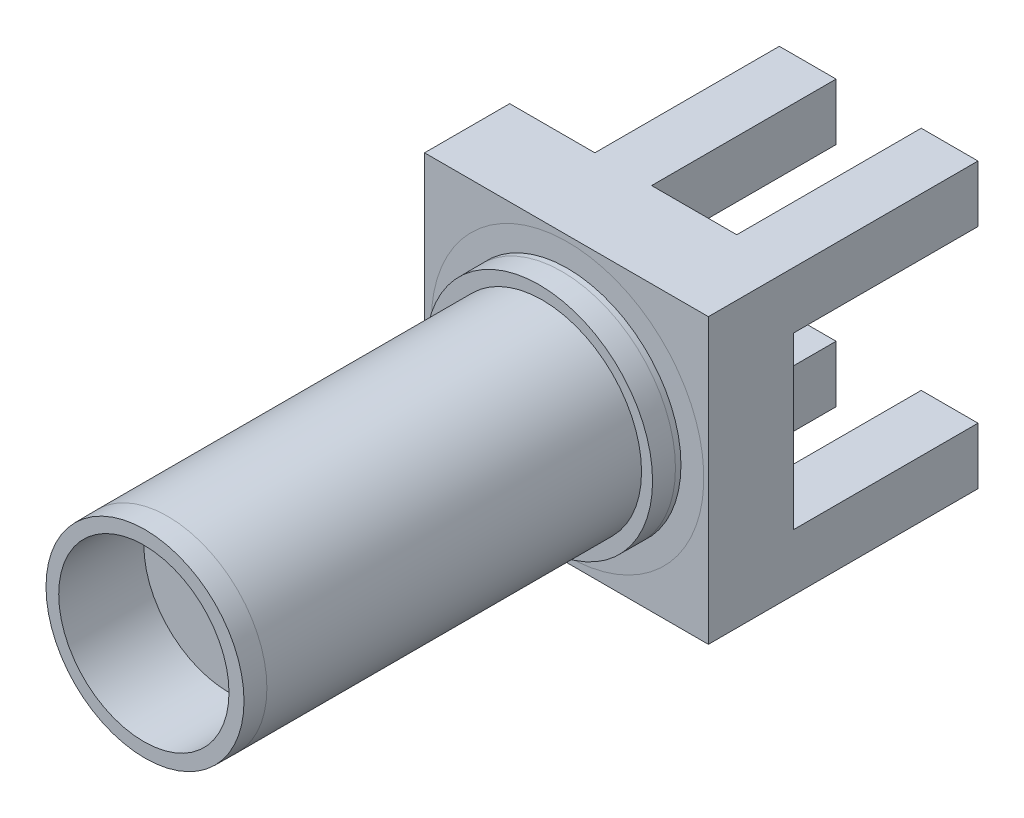
ISO-10303-21;
HEADER;
FILE_DESCRIPTION(('STEP AP214'),'2;1');
FILE_NAME('part.step','',(''),(''),'','','');
FILE_SCHEMA(('AUTOMOTIVE_DESIGN { 1 0 10303 214 1 1 1 1 }'));
ENDSEC;
DATA;
#1=APPLICATION_CONTEXT('core data for automotive mechanical design processes');
#2=APPLICATION_PROTOCOL_DEFINITION('international standard','automotive_design',2000,#1);
#3=PRODUCT_CONTEXT('',#1,'mechanical');
#4=PRODUCT('Part','Part','',(#3));
#5=PRODUCT_RELATED_PRODUCT_CATEGORY('part','',(#4));
#6=PRODUCT_DEFINITION_FORMATION('','',#4);
#7=PRODUCT_DEFINITION_CONTEXT('part definition',#1,'design');
#8=PRODUCT_DEFINITION('design','',#6,#7);
#9=PRODUCT_DEFINITION_SHAPE('','',#8);
#10=(LENGTH_UNIT() NAMED_UNIT(*) SI_UNIT(.MILLI.,.METRE.));
#11=(NAMED_UNIT(*) PLANE_ANGLE_UNIT() SI_UNIT($,.RADIAN.));
#12=(NAMED_UNIT(*) SI_UNIT($,.STERADIAN.) SOLID_ANGLE_UNIT());
#13=UNCERTAINTY_MEASURE_WITH_UNIT(LENGTH_MEASURE(1.E-05),#10,'distance_accuracy_value','');
#14=(GEOMETRIC_REPRESENTATION_CONTEXT(3) GLOBAL_UNCERTAINTY_ASSIGNED_CONTEXT((#13)) GLOBAL_UNIT_ASSIGNED_CONTEXT((#10,
#11,#12)) REPRESENTATION_CONTEXT('',''));
#15=CARTESIAN_POINT('',(0.,0.,0.));
#16=DIRECTION('',(0.,0.,1.));
#17=DIRECTION('',(1.,0.,0.));
#18=AXIS2_PLACEMENT_3D('',#15,#16,#17);
#19=CARTESIAN_POINT('',(-6.14624505928853,5.,-6.5));
#20=DIRECTION('',(0.,0.,1.));
#21=DIRECTION('',(1.,0.,0.));
#22=AXIS2_PLACEMENT_3D('',#19,#20,#21);
#23=CYLINDRICAL_SURFACE('',#22,1.);
#24=CARTESIAN_POINT('',(-6.14624505928853,5.,-6.3));
#25=DIRECTION('',(0.,0.,-1.));
#26=DIRECTION('',(-1.,0.,0.));
#27=AXIS2_PLACEMENT_3D('',#24,#25,#26);
#28=CIRCLE('',#27,1.);
#29=CARTESIAN_POINT('',(-5.14624505928853,5.,-6.3));
#30=VERTEX_POINT('',#29);
#31=EDGE_CURVE('E11',#30,#30,#28,.F.);
#32=CARTESIAN_POINT('',(-6.14624505928853,5.,0.));
#33=DIRECTION('',(0.,0.,-1.));
#34=DIRECTION('',(-1.,0.,0.));
#35=AXIS2_PLACEMENT_3D('',#32,#33,#34);
#36=CIRCLE('',#35,1.);
#37=CARTESIAN_POINT('',(-5.14624505928853,5.,0.));
#38=VERTEX_POINT('',#37);
#39=EDGE_CURVE('E62',#38,#38,#36,.T.);
#40=CARTESIAN_POINT('',(-5.14624505928853,5.,-6.3));
#41=CARTESIAN_POINT('',(-5.14624505928853,5.,-6.234375));
#42=CARTESIAN_POINT('',(-5.14624505928853,5.,-6.16875));
#43=CARTESIAN_POINT('',(-5.14624505928853,5.,-6.0375));
#44=CARTESIAN_POINT('',(-5.14624505928853,5.,-5.971875));
#45=CARTESIAN_POINT('',(-5.14624505928853,5.,-5.840625));
#46=CARTESIAN_POINT('',(-5.14624505928853,5.,-5.775));
#47=CARTESIAN_POINT('',(-5.14624505928853,5.,-5.64375));
#48=CARTESIAN_POINT('',(-5.14624505928853,5.,-5.578125));
#49=CARTESIAN_POINT('',(-5.14624505928853,5.,-5.446875));
#50=CARTESIAN_POINT('',(-5.14624505928853,5.,-5.38125));
#51=CARTESIAN_POINT('',(-5.14624505928853,5.,-5.25));
#52=CARTESIAN_POINT('',(-5.14624505928853,5.,-5.184375));
#53=CARTESIAN_POINT('',(-5.14624505928853,5.,-5.053125));
#54=CARTESIAN_POINT('',(-5.14624505928853,5.,-4.9875));
#55=CARTESIAN_POINT('',(-5.14624505928853,5.,-4.85625));
#56=CARTESIAN_POINT('',(-5.14624505928853,5.,-4.790625));
#57=CARTESIAN_POINT('',(-5.14624505928853,5.,-4.659375));
#58=CARTESIAN_POINT('',(-5.14624505928853,5.,-4.59375));
#59=CARTESIAN_POINT('',(-5.14624505928853,5.,-4.4625));
#60=CARTESIAN_POINT('',(-5.14624505928853,5.,-4.396875));
#61=CARTESIAN_POINT('',(-5.14624505928853,5.,-4.265625));
#62=CARTESIAN_POINT('',(-5.14624505928853,5.,-4.2));
#63=CARTESIAN_POINT('',(-5.14624505928853,5.,-4.06875));
#64=CARTESIAN_POINT('',(-5.14624505928853,5.,-4.003125));
#65=CARTESIAN_POINT('',(-5.14624505928853,5.,-3.871875));
#66=CARTESIAN_POINT('',(-5.14624505928853,5.,-3.80625));
#67=CARTESIAN_POINT('',(-5.14624505928853,5.,-3.675));
#68=CARTESIAN_POINT('',(-5.14624505928853,5.,-3.609375));
#69=CARTESIAN_POINT('',(-5.14624505928853,5.,-3.478125));
#70=CARTESIAN_POINT('',(-5.14624505928853,5.,-3.4125));
#71=CARTESIAN_POINT('',(-5.14624505928853,5.,-3.28125));
#72=CARTESIAN_POINT('',(-5.14624505928853,5.,-3.215625));
#73=CARTESIAN_POINT('',(-5.14624505928853,5.,-3.084375));
#74=CARTESIAN_POINT('',(-5.14624505928853,5.,-3.01875));
#75=CARTESIAN_POINT('',(-5.14624505928853,5.,-2.8875));
#76=CARTESIAN_POINT('',(-5.14624505928853,5.,-2.821875));
#77=CARTESIAN_POINT('',(-5.14624505928853,5.,-2.690625));
#78=CARTESIAN_POINT('',(-5.14624505928853,5.,-2.625));
#79=CARTESIAN_POINT('',(-5.14624505928853,5.,-2.49375));
#80=CARTESIAN_POINT('',(-5.14624505928853,5.,-2.428125));
#81=CARTESIAN_POINT('',(-5.14624505928853,5.,-2.296875));
#82=CARTESIAN_POINT('',(-5.14624505928853,5.,-2.23125));
#83=CARTESIAN_POINT('',(-5.14624505928853,5.,-2.1));
#84=CARTESIAN_POINT('',(-5.14624505928853,5.,-2.034375));
#85=CARTESIAN_POINT('',(-5.14624505928853,5.,-1.903125));
#86=CARTESIAN_POINT('',(-5.14624505928853,5.,-1.8375));
#87=CARTESIAN_POINT('',(-5.14624505928853,5.,-1.70625));
#88=CARTESIAN_POINT('',(-5.14624505928853,5.,-1.640625));
#89=CARTESIAN_POINT('',(-5.14624505928853,5.,-1.509375));
#90=CARTESIAN_POINT('',(-5.14624505928853,5.,-1.44375));
#91=CARTESIAN_POINT('',(-5.14624505928853,5.,-1.3125));
#92=CARTESIAN_POINT('',(-5.14624505928853,5.,-1.246875));
#93=CARTESIAN_POINT('',(-5.14624505928853,5.,-1.115625));
#94=CARTESIAN_POINT('',(-5.14624505928853,5.,-1.05));
#95=CARTESIAN_POINT('',(-5.14624505928853,5.,-0.918750000000001));
#96=CARTESIAN_POINT('',(-5.14624505928853,5.,-0.853125));
#97=CARTESIAN_POINT('',(-5.14624505928853,5.,-0.721875));
#98=CARTESIAN_POINT('',(-5.14624505928853,5.,-0.65625));
#99=CARTESIAN_POINT('',(-5.14624505928853,5.,-0.525));
#100=CARTESIAN_POINT('',(-5.14624505928853,5.,-0.459375));
#101=CARTESIAN_POINT('',(-5.14624505928853,5.,-0.328125));
#102=CARTESIAN_POINT('',(-5.14624505928853,5.,-0.2625));
#103=CARTESIAN_POINT('',(-5.14624505928853,5.,-0.13125));
#104=CARTESIAN_POINT('',(-5.14624505928853,5.,-0.065625));
#105=CARTESIAN_POINT('',(-5.14624505928853,5.,0.));
#106=B_SPLINE_CURVE_WITH_KNOTS('',3,(#40,#41,#42,#43,#44,#45,#46,#47,#48,#49,#50,#51,#52,#53,
#54,#55,#56,#57,#58,#59,#60,#61,#62,#63,#64,#65,#66,#67,#68,#69,#70,#71,#72,#73,#74,#75,#76,#77,
#78,#79,#80,#81,#82,#83,#84,#85,#86,#87,#88,#89,#90,#91,#92,#93,#94,#95,#96,#97,#98,#99,#100,
#101,#102,#103,#104,#105),.UNSPECIFIED.,.F.,.F.,(4,2,2,2,2,2,2,2,2,2,2,2,2,2,2,2,2,2,2,2,2,2,2,
2,2,2,2,2,2,2,2,2,4),(0.,0.196875,0.39375,0.590625,0.7875,0.984375,1.18125,1.378125,1.575,
1.771875,1.96875,2.165625,2.3625,2.559375,2.75625,2.953125,3.15,3.346875,3.54375,3.740625,
3.9375,4.134375,4.33125,4.528125,4.725,4.921875,5.11875,5.315625,5.5125,5.709375,5.90625,
6.103125,6.3),.UNSPECIFIED.);
#107=EDGE_CURVE('BSEAM50',#30,#38,#106,.T.);
#108=ORIENTED_EDGE('',*,*,#31,.T.);
#109=ORIENTED_EDGE('',*,*,#39,.T.);
#110=ORIENTED_EDGE('',*,*,#107,.T.);
#111=ORIENTED_EDGE('',*,*,#107,.F.);
#112=EDGE_LOOP('',(#108,#110,#109,#111));
#113=FACE_BOUND('',#112,.T.);
#114=ADVANCED_FACE('F50',(#113),#23,.T.);
#115=CARTESIAN_POINT('',(-6.14624505928853,5.,-6.5));
#116=DIRECTION('',(0.,0.,-1.));
#117=DIRECTION('',(-1.,0.,0.));
#118=AXIS2_PLACEMENT_3D('',#115,#116,#117);
#119=PLANE('',#118);
#120=CARTESIAN_POINT('',(-6.14624505928853,5.,-6.5));
#121=DIRECTION('',(0.,0.,-1.));
#122=DIRECTION('',(-1.,0.,0.));
#123=AXIS2_PLACEMENT_3D('',#120,#121,#122);
#124=CIRCLE('',#123,0.800000000000005);
#125=CARTESIAN_POINT('',(-6.94624505928853,5.,-6.5));
#126=VERTEX_POINT('',#125);
#127=EDGE_CURVE('E58',#126,#126,#124,.T.);
#128=ORIENTED_EDGE('',*,*,#127,.T.);
#129=EDGE_LOOP('',(#128));
#130=FACE_BOUND('',#129,.T.);
#131=ADVANCED_FACE('F72',(#130),#119,.T.);
#132=CARTESIAN_POINT('',(-6.14624505928853,5.,0.));
#133=DIRECTION('',(0.,0.,-1.));
#134=DIRECTION('',(-1.,0.,0.));
#135=AXIS2_PLACEMENT_3D('',#132,#133,#134);
#136=PLANE('',#135);
#137=ORIENTED_EDGE('',*,*,#39,.F.);
#138=EDGE_LOOP('',(#137));
#139=FACE_BOUND('',#138,.T.);
#140=ADVANCED_FACE('F70',(#139),#136,.F.);
#141=CARTESIAN_POINT('',(-6.14624505928853,5.,-6.5));
#142=DIRECTION('',(0.,0.,1.));
#143=DIRECTION('',(1.,0.,0.));
#144=AXIS2_PLACEMENT_3D('',#141,#142,#143);
#145=CONICAL_SURFACE('',#144,0.800000000000005,0.785398163397446);
#146=ORIENTED_EDGE('',*,*,#31,.F.);
#147=EDGE_LOOP('',(#146));
#148=FACE_BOUND('',#147,.T.);
#149=ORIENTED_EDGE('',*,*,#127,.F.);
#150=EDGE_LOOP('',(#149));
#151=FACE_BOUND('',#150,.T.);
#152=ADVANCED_FACE('F53',(#148,#151),#145,.T.);
#153=CLOSED_SHELL('',(#114,#131,#140,#152));
#154=MANIFOLD_SOLID_BREP('B2',#153);
#155=CARTESIAN_POINT('',(0.,0.,0.));
#156=DIRECTION('',(0.,0.,-1.));
#157=DIRECTION('',(-1.,0.,0.));
#158=AXIS2_PLACEMENT_3D('',#155,#156,#157);
#159=PLANE('',#158);
#160=CARTESIAN_POINT('',(-6.14624505928853,5.,0.));
#161=DIRECTION('',(0.,0.,1.));
#162=DIRECTION('',(1.,0.,0.));
#163=AXIS2_PLACEMENT_3D('',#160,#161,#162);
#164=CIRCLE('',#163,2.5);
#165=CARTESIAN_POINT('',(-8.64624505928853,5.,0.));
#166=VERTEX_POINT('',#165);
#167=EDGE_CURVE('E341',#166,#166,#164,.T.);
#168=ORIENTED_EDGE('',*,*,#167,.T.);
#169=EDGE_LOOP('',(#168));
#170=FACE_BOUND('',#169,.T.);
#171=DIRECTION('',(0.,1.,0.));
#172=VECTOR('',#171,1.);
#173=CARTESIAN_POINT('',(-3.14624505928853,10.,0.));
#174=LINE('',#173,#172);
#175=CARTESIAN_POINT('',(-3.14624505928853,8.,0.));
#176=VERTEX_POINT('',#175);
#177=CARTESIAN_POINT('',(-3.14624505928853,10.,0.));
#178=VERTEX_POINT('',#177);
#179=EDGE_CURVE('E261',#176,#178,#174,.T.);
#180=ORIENTED_EDGE('',*,*,#179,.F.);
#181=DIRECTION('',(-1.,0.,0.));
#182=VECTOR('',#181,1.);
#183=CARTESIAN_POINT('',(-1.14624505928853,8.,0.));
#184=LINE('',#183,#182);
#185=CARTESIAN_POINT('',(-1.14624505928853,8.,0.));
#186=VERTEX_POINT('',#185);
#187=EDGE_CURVE('E407',#186,#176,#184,.T.);
#188=ORIENTED_EDGE('',*,*,#187,.F.);
#189=DIRECTION('',(0.,1.,0.));
#190=VECTOR('',#189,1.);
#191=CARTESIAN_POINT('',(-1.14624505928853,0.,0.));
#192=LINE('',#191,#190);
#193=CARTESIAN_POINT('',(-1.14624505928853,2.,0.));
#194=VERTEX_POINT('',#193);
#195=EDGE_CURVE('E266',#194,#186,#192,.T.);
#196=ORIENTED_EDGE('',*,*,#195,.F.);
#197=DIRECTION('',(-1.,0.,0.));
#198=VECTOR('',#197,1.);
#199=CARTESIAN_POINT('',(-1.14624505928853,2.,0.));
#200=LINE('',#199,#198);
#201=CARTESIAN_POINT('',(-3.14624505928853,2.,0.));
#202=VERTEX_POINT('',#201);
#203=EDGE_CURVE('E315',#194,#202,#200,.T.);
#204=ORIENTED_EDGE('',*,*,#203,.T.);
#205=DIRECTION('',(0.,1.,0.));
#206=VECTOR('',#205,1.);
#207=CARTESIAN_POINT('',(-3.14624505928853,0.,0.));
#208=LINE('',#207,#206);
#209=CARTESIAN_POINT('',(-3.14624505928853,0.,0.));
#210=VERTEX_POINT('',#209);
#211=EDGE_CURVE('E328',#210,#202,#208,.T.);
#212=ORIENTED_EDGE('',*,*,#211,.F.);
#213=DIRECTION('',(-1.,0.,0.));
#214=VECTOR('',#213,1.);
#215=CARTESIAN_POINT('',(-1.14624505928853,0.,0.));
#216=LINE('',#215,#214);
#217=CARTESIAN_POINT('',(-6.14624505928853,0.,0.));
#218=VERTEX_POINT('',#217);
#219=EDGE_CURVE('E370',#210,#218,#216,.T.);
#220=ORIENTED_EDGE('',*,*,#219,.T.);
#221=DIRECTION('',(0.,1.,0.));
#222=VECTOR('',#221,1.);
#223=CARTESIAN_POINT('',(-6.14624505928853,0.,0.));
#224=LINE('',#223,#222);
#225=CARTESIAN_POINT('',(-6.14624505928853,2.,0.));
#226=VERTEX_POINT('',#225);
#227=EDGE_CURVE('E138',#218,#226,#224,.T.);
#228=ORIENTED_EDGE('',*,*,#227,.T.);
#229=DIRECTION('',(-1.,0.,0.));
#230=VECTOR('',#229,1.);
#231=CARTESIAN_POINT('',(-6.14624505928853,2.,0.));
#232=LINE('',#231,#230);
#233=CARTESIAN_POINT('',(-8.14624505928853,2.,0.));
#234=VERTEX_POINT('',#233);
#235=EDGE_CURVE('E296',#226,#234,#232,.T.);
#236=ORIENTED_EDGE('',*,*,#235,.T.);
#237=DIRECTION('',(0.,1.,0.));
#238=VECTOR('',#237,1.);
#239=CARTESIAN_POINT('',(-8.14624505928853,0.,0.));
#240=LINE('',#239,#238);
#241=CARTESIAN_POINT('',(-8.14624505928853,0.,0.));
#242=VERTEX_POINT('',#241);
#243=EDGE_CURVE('E309',#242,#234,#240,.T.);
#244=ORIENTED_EDGE('',*,*,#243,.F.);
#245=CARTESIAN_POINT('',(-11.1462450592885,0.,0.));
#246=VERTEX_POINT('',#245);
#247=EDGE_CURVE('E369',#242,#246,#216,.T.);
#248=ORIENTED_EDGE('',*,*,#247,.T.);
#249=DIRECTION('',(0.,1.,0.));
#250=VECTOR('',#249,1.);
#251=CARTESIAN_POINT('',(-11.1462450592885,0.,0.));
#252=LINE('',#251,#250);
#253=CARTESIAN_POINT('',(-11.1462450592885,10.,0.));
#254=VERTEX_POINT('',#253);
#255=EDGE_CURVE('E366',#246,#254,#252,.T.);
#256=ORIENTED_EDGE('',*,*,#255,.T.);
#257=DIRECTION('',(-1.,0.,0.));
#258=VECTOR('',#257,1.);
#259=CARTESIAN_POINT('',(-1.14624505928853,10.,0.));
#260=LINE('',#259,#258);
#261=CARTESIAN_POINT('',(-8.14624505928853,10.,0.));
#262=VERTEX_POINT('',#261);
#263=EDGE_CURVE('E352',#262,#254,#260,.T.);
#264=ORIENTED_EDGE('',*,*,#263,.F.);
#265=DIRECTION('',(0.,1.,0.));
#266=VECTOR('',#265,1.);
#267=CARTESIAN_POINT('',(-8.14624505928853,10.,0.));
#268=LINE('',#267,#266);
#269=CARTESIAN_POINT('',(-8.14624505928853,8.,0.));
#270=VERTEX_POINT('',#269);
#271=EDGE_CURVE('E130',#270,#262,#268,.T.);
#272=ORIENTED_EDGE('',*,*,#271,.F.);
#273=DIRECTION('',(-1.,0.,0.));
#274=VECTOR('',#273,1.);
#275=CARTESIAN_POINT('',(-6.14624505928853,8.,0.));
#276=LINE('',#275,#274);
#277=CARTESIAN_POINT('',(-6.14624505928853,8.,0.));
#278=VERTEX_POINT('',#277);
#279=EDGE_CURVE('E278',#278,#270,#276,.T.);
#280=ORIENTED_EDGE('',*,*,#279,.F.);
#281=DIRECTION('',(0.,-1.,0.));
#282=VECTOR('',#281,1.);
#283=CARTESIAN_POINT('',(-6.14624505928853,10.,0.));
#284=LINE('',#283,#282);
#285=CARTESIAN_POINT('',(-6.14624505928853,10.,0.));
#286=VERTEX_POINT('',#285);
#287=EDGE_CURVE('E268',#286,#278,#284,.T.);
#288=ORIENTED_EDGE('',*,*,#287,.F.);
#289=EDGE_CURVE('E364',#178,#286,#260,.T.);
#290=ORIENTED_EDGE('',*,*,#289,.F.);
#291=EDGE_LOOP('',(#180,#188,#196,#204,#212,#220,#228,#236,#244,#248,#256,#264,#272,#280,#288,#290));
#292=FACE_BOUND('',#291,.T.);
#293=ADVANCED_FACE('F114',(#170,#292),#159,.T.);
#294=CARTESIAN_POINT('',(-1.14624505928853,10.,3.));
#295=DIRECTION('',(0.,-1.,0.));
#296=DIRECTION('',(0.,0.,-1.));
#297=AXIS2_PLACEMENT_3D('',#294,#295,#296);
#298=PLANE('',#297);
#299=DIRECTION('',(0.,0.,-1.));
#300=VECTOR('',#299,1.);
#301=CARTESIAN_POINT('',(-1.14624505928853,10.,3.));
#302=LINE('',#301,#300);
#303=CARTESIAN_POINT('',(-1.14624505928853,10.,3.));
#304=VERTEX_POINT('',#303);
#305=CARTESIAN_POINT('',(-1.14624505928853,10.,-6.5));
#306=VERTEX_POINT('',#305);
#307=EDGE_CURVE('E363',#304,#306,#302,.T.);
#308=ORIENTED_EDGE('',*,*,#307,.T.);
#309=DIRECTION('',(1.,0.,0.));
#310=VECTOR('',#309,1.);
#311=CARTESIAN_POINT('',(-1.14624505928853,10.,-6.5));
#312=LINE('',#311,#310);
#313=CARTESIAN_POINT('',(-3.14624505928853,10.,-6.5));
#314=VERTEX_POINT('',#313);
#315=EDGE_CURVE('E258',#314,#306,#312,.T.);
#316=ORIENTED_EDGE('',*,*,#315,.F.);
#317=DIRECTION('',(0.,0.,1.));
#318=VECTOR('',#317,1.);
#319=CARTESIAN_POINT('',(-3.14624505928853,10.,-6.5));
#320=LINE('',#319,#318);
#321=EDGE_CURVE('E270',#314,#178,#320,.T.);
#322=ORIENTED_EDGE('',*,*,#321,.T.);
#323=ORIENTED_EDGE('',*,*,#289,.T.);
#324=DIRECTION('',(0.,0.,1.));
#325=VECTOR('',#324,1.);
#326=CARTESIAN_POINT('',(-6.14624505928853,10.,-6.5));
#327=LINE('',#326,#325);
#328=CARTESIAN_POINT('',(-6.14624505928853,10.,-6.5));
#329=VERTEX_POINT('',#328);
#330=EDGE_CURVE('E291',#329,#286,#327,.T.);
#331=ORIENTED_EDGE('',*,*,#330,.F.);
#332=DIRECTION('',(1.,0.,0.));
#333=VECTOR('',#332,1.);
#334=CARTESIAN_POINT('',(-6.14624505928853,10.,-6.5));
#335=LINE('',#334,#333);
#336=CARTESIAN_POINT('',(-8.14624505928853,10.,-6.5));
#337=VERTEX_POINT('',#336);
#338=EDGE_CURVE('E277',#337,#329,#335,.T.);
#339=ORIENTED_EDGE('',*,*,#338,.F.);
#340=DIRECTION('',(0.,0.,1.));
#341=VECTOR('',#340,1.);
#342=CARTESIAN_POINT('',(-8.14624505928853,10.,-6.5));
#343=LINE('',#342,#341);
#344=EDGE_CURVE('E294',#337,#262,#343,.T.);
#345=ORIENTED_EDGE('',*,*,#344,.T.);
#346=ORIENTED_EDGE('',*,*,#263,.T.);
#347=DIRECTION('',(0.,0.,-1.));
#348=VECTOR('',#347,1.);
#349=CARTESIAN_POINT('',(-11.1462450592885,10.,3.));
#350=LINE('',#349,#348);
#351=CARTESIAN_POINT('',(-11.1462450592885,10.,3.));
#352=VERTEX_POINT('',#351);
#353=EDGE_CURVE('E379',#352,#254,#350,.T.);
#354=ORIENTED_EDGE('',*,*,#353,.F.);
#355=DIRECTION('',(-1.,0.,0.));
#356=VECTOR('',#355,1.);
#357=CARTESIAN_POINT('',(-1.14624505928853,10.,3.));
#358=LINE('',#357,#356);
#359=EDGE_CURVE('E353',#304,#352,#358,.T.);
#360=ORIENTED_EDGE('',*,*,#359,.F.);
#361=EDGE_LOOP('',(#308,#316,#322,#323,#331,#339,#345,#346,#354,#360));
#362=FACE_BOUND('',#361,.T.);
#363=ADVANCED_FACE('F414',(#362),#298,.F.);
#364=CARTESIAN_POINT('',(-11.1462450592885,0.,3.));
#365=DIRECTION('',(-1.,0.,0.));
#366=DIRECTION('',(0.,0.,1.));
#367=AXIS2_PLACEMENT_3D('',#364,#365,#366);
#368=PLANE('',#367);
#369=ORIENTED_EDGE('',*,*,#255,.F.);
#370=DIRECTION('',(0.,0.,-1.));
#371=VECTOR('',#370,1.);
#372=CARTESIAN_POINT('',(-11.1462450592885,0.,3.));
#373=LINE('',#372,#371);
#374=CARTESIAN_POINT('',(-11.1462450592885,0.,3.));
#375=VERTEX_POINT('',#374);
#376=EDGE_CURVE('E376',#375,#246,#373,.T.);
#377=ORIENTED_EDGE('',*,*,#376,.F.);
#378=DIRECTION('',(0.,1.,0.));
#379=VECTOR('',#378,1.);
#380=CARTESIAN_POINT('',(-11.1462450592885,0.,3.));
#381=LINE('',#380,#379);
#382=EDGE_CURVE('E355',#375,#352,#381,.T.);
#383=ORIENTED_EDGE('',*,*,#382,.T.);
#384=ORIENTED_EDGE('',*,*,#353,.T.);
#385=EDGE_LOOP('',(#369,#377,#383,#384));
#386=FACE_BOUND('',#385,.T.);
#387=ADVANCED_FACE('F436',(#386),#368,.T.);
#388=CARTESIAN_POINT('',(-1.14624505928853,0.,3.));
#389=DIRECTION('',(0.,-1.,0.));
#390=DIRECTION('',(1.,0.,0.));
#391=AXIS2_PLACEMENT_3D('',#388,#389,#390);
#392=PLANE('',#391);
#393=ORIENTED_EDGE('',*,*,#219,.F.);
#394=DIRECTION('',(0.,0.,1.));
#395=VECTOR('',#394,1.);
#396=CARTESIAN_POINT('',(-3.14624505928853,0.,-6.5));
#397=LINE('',#396,#395);
#398=CARTESIAN_POINT('',(-3.14624505928853,0.,-6.5));
#399=VERTEX_POINT('',#398);
#400=EDGE_CURVE('E342',#399,#210,#397,.T.);
#401=ORIENTED_EDGE('',*,*,#400,.F.);
#402=DIRECTION('',(-1.,0.,0.));
#403=VECTOR('',#402,1.);
#404=CARTESIAN_POINT('',(-1.14624505928853,0.,-6.5));
#405=LINE('',#404,#403);
#406=CARTESIAN_POINT('',(-1.14624505928853,0.,-6.5));
#407=VERTEX_POINT('',#406);
#408=EDGE_CURVE('E330',#407,#399,#405,.T.);
#409=ORIENTED_EDGE('',*,*,#408,.F.);
#410=DIRECTION('',(0.,0.,-1.));
#411=VECTOR('',#410,1.);
#412=CARTESIAN_POINT('',(-1.14624505928853,0.,3.));
#413=LINE('',#412,#411);
#414=CARTESIAN_POINT('',(-1.14624505928853,0.,3.));
#415=VERTEX_POINT('',#414);
#416=EDGE_CURVE('E374',#415,#407,#413,.T.);
#417=ORIENTED_EDGE('',*,*,#416,.F.);
#418=DIRECTION('',(-1.,0.,0.));
#419=VECTOR('',#418,1.);
#420=CARTESIAN_POINT('',(-1.14624505928853,0.,3.));
#421=LINE('',#420,#419);
#422=EDGE_CURVE('E358',#415,#375,#421,.T.);
#423=ORIENTED_EDGE('',*,*,#422,.T.);
#424=ORIENTED_EDGE('',*,*,#376,.T.);
#425=ORIENTED_EDGE('',*,*,#247,.F.);
#426=DIRECTION('',(0.,0.,1.));
#427=VECTOR('',#426,1.);
#428=CARTESIAN_POINT('',(-8.14624505928853,0.,-6.5));
#429=LINE('',#428,#427);
#430=CARTESIAN_POINT('',(-8.14624505928853,0.,-6.5));
#431=VERTEX_POINT('',#430);
#432=EDGE_CURVE('E319',#431,#242,#429,.T.);
#433=ORIENTED_EDGE('',*,*,#432,.F.);
#434=DIRECTION('',(-1.,0.,0.));
#435=VECTOR('',#434,1.);
#436=CARTESIAN_POINT('',(-6.14624505928853,0.,-6.5));
#437=LINE('',#436,#435);
#438=CARTESIAN_POINT('',(-6.14624505928853,0.,-6.5));
#439=VERTEX_POINT('',#438);
#440=EDGE_CURVE('E302',#439,#431,#437,.T.);
#441=ORIENTED_EDGE('',*,*,#440,.F.);
#442=DIRECTION('',(0.,0.,1.));
#443=VECTOR('',#442,1.);
#444=CARTESIAN_POINT('',(-6.14624505928853,0.,-6.5));
#445=LINE('',#444,#443);
#446=EDGE_CURVE('E316',#439,#218,#445,.T.);
#447=ORIENTED_EDGE('',*,*,#446,.T.);
#448=EDGE_LOOP('',(#393,#401,#409,#417,#423,#424,#425,#433,#441,#447));
#449=FACE_BOUND('',#448,.T.);
#450=ADVANCED_FACE('F448',(#449),#392,.T.);
#451=CARTESIAN_POINT('',(-1.14624505928853,0.,3.));
#452=DIRECTION('',(-1.,0.,0.));
#453=DIRECTION('',(0.,0.,1.));
#454=AXIS2_PLACEMENT_3D('',#451,#452,#453);
#455=PLANE('',#454);
#456=ORIENTED_EDGE('',*,*,#416,.T.);
#457=DIRECTION('',(0.,1.,0.));
#458=VECTOR('',#457,1.);
#459=CARTESIAN_POINT('',(-1.14624505928853,0.,-6.5));
#460=LINE('',#459,#458);
#461=CARTESIAN_POINT('',(-1.14624505928853,2.,-6.5));
#462=VERTEX_POINT('',#461);
#463=EDGE_CURVE('E332',#407,#462,#460,.T.);
#464=ORIENTED_EDGE('',*,*,#463,.T.);
#465=DIRECTION('',(0.,0.,1.));
#466=VECTOR('',#465,1.);
#467=CARTESIAN_POINT('',(-1.14624505928853,2.,-6.5));
#468=LINE('',#467,#466);
#469=EDGE_CURVE('E339',#462,#194,#468,.T.);
#470=ORIENTED_EDGE('',*,*,#469,.T.);
#471=ORIENTED_EDGE('',*,*,#195,.T.);
#472=DIRECTION('',(0.,0.,1.));
#473=VECTOR('',#472,1.);
#474=CARTESIAN_POINT('',(-1.14624505928853,8.,-6.5));
#475=LINE('',#474,#473);
#476=CARTESIAN_POINT('',(-1.14624505928853,8.,-6.5));
#477=VERTEX_POINT('',#476);
#478=EDGE_CURVE('E245',#477,#186,#475,.T.);
#479=ORIENTED_EDGE('',*,*,#478,.F.);
#480=DIRECTION('',(0.,-1.,0.));
#481=VECTOR('',#480,1.);
#482=CARTESIAN_POINT('',(-1.14624505928853,10.,-6.5));
#483=LINE('',#482,#481);
#484=EDGE_CURVE('E252',#306,#477,#483,.T.);
#485=ORIENTED_EDGE('',*,*,#484,.F.);
#486=ORIENTED_EDGE('',*,*,#307,.F.);
#487=DIRECTION('',(0.,1.,0.));
#488=VECTOR('',#487,1.);
#489=CARTESIAN_POINT('',(-1.14624505928853,0.,3.));
#490=LINE('',#489,#488);
#491=EDGE_CURVE('E361',#415,#304,#490,.T.);
#492=ORIENTED_EDGE('',*,*,#491,.F.);
#493=EDGE_LOOP('',(#456,#464,#470,#471,#479,#485,#486,#492));
#494=FACE_BOUND('',#493,.T.);
#495=ADVANCED_FACE('F264',(#494),#455,.F.);
#496=CARTESIAN_POINT('',(0.,0.,3.));
#497=DIRECTION('',(0.,0.,-1.));
#498=DIRECTION('',(-1.,0.,0.));
#499=AXIS2_PLACEMENT_3D('',#496,#497,#498);
#500=PLANE('',#499);
#501=CARTESIAN_POINT('',(-6.10617501497278,5.,3.));
#502=DIRECTION('',(0.,0.,-1.));
#503=DIRECTION('',(-1.,0.,0.));
#504=AXIS2_PLACEMENT_3D('',#501,#502,#503);
#505=CIRCLE('',#504,4.79999999999969);
#506=CARTESIAN_POINT('',(-10.9061750149725,5.,3.));
#507=VERTEX_POINT('',#506);
#508=EDGE_CURVE('E388',#507,#507,#505,.T.);
#509=ORIENTED_EDGE('',*,*,#508,.T.);
#510=EDGE_LOOP('',(#509));
#511=FACE_BOUND('',#510,.T.);
#512=ORIENTED_EDGE('',*,*,#359,.T.);
#513=ORIENTED_EDGE('',*,*,#382,.F.);
#514=ORIENTED_EDGE('',*,*,#422,.F.);
#515=ORIENTED_EDGE('',*,*,#491,.T.);
#516=EDGE_LOOP('',(#512,#513,#514,#515));
#517=FACE_BOUND('',#516,.T.);
#518=ADVANCED_FACE('F440',(#511,#517),#500,.F.);
#519=CARTESIAN_POINT('',(-1.14624505928853,5.,0.));
#520=DIRECTION('',(0.,-1.,0.));
#521=DIRECTION('',(0.,0.,-1.));
#522=AXIS2_PLACEMENT_3D('',#519,#520,#521);
#523=TOROIDAL_SURFACE('',#522,5.,2.5);
#524=CARTESIAN_POINT('',(-6.10897581749512,5.,0.609346717025921));
#525=DIRECTION('',(0.121869343405184,0.,0.992546151641318));
#526=DIRECTION('',(0.992546151641318,0.,-0.121869343405184));
#527=AXIS2_PLACEMENT_3D('',#524,#525,#526);
#528=CIRCLE('',#527,2.5);
#529=CARTESIAN_POINT('',(-8.59034119659841,5.,0.914020075538881));
#530=VERTEX_POINT('',#529);
#531=EDGE_CURVE('E349',#530,#530,#528,.T.);
#532=CARTESIAN_POINT('',(-1.14624505928853,5.,0.));
#533=DIRECTION('',(0.,-1.,0.));
#534=DIRECTION('',(0.,0.,-1.));
#535=AXIS2_PLACEMENT_3D('',#532,#533,#534);
#536=CIRCLE('',#535,7.5);
#537=EDGE_CURVE('',#530,#166,#536,.T.);
#538=ORIENTED_EDGE('',*,*,#531,.T.);
#539=ORIENTED_EDGE('',*,*,#167,.F.);
#540=ORIENTED_EDGE('',*,*,#537,.T.);
#541=ORIENTED_EDGE('',*,*,#537,.F.);
#542=EDGE_LOOP('',(#538,#540,#539,#541));
#543=FACE_BOUND('',#542,.T.);
#544=ADVANCED_FACE('F640',(#543),#523,.F.);
#545=CARTESIAN_POINT('',(-0.00854393685382568,0.,-0.139692132756929));
#546=DIRECTION('',(0.121869343405184,0.,0.992546151641318));
#547=DIRECTION('',(0.992546151641318,0.,-0.121869343405184));
#548=AXIS2_PLACEMENT_3D('',#545,#546,#547);
#549=PLANE('',#548);
#550=ORIENTED_EDGE('',*,*,#531,.F.);
#551=EDGE_LOOP('',(#550));
#552=FACE_BOUND('',#551,.T.);
#553=ADVANCED_FACE('F801',(#552),#549,.F.);
#554=CARTESIAN_POINT('',(-1.14624505928853,2.,-6.5));
#555=DIRECTION('',(0.,1.,0.));
#556=DIRECTION('',(0.,0.,1.));
#557=AXIS2_PLACEMENT_3D('',#554,#555,#556);
#558=PLANE('',#557);
#559=ORIENTED_EDGE('',*,*,#203,.F.);
#560=ORIENTED_EDGE('',*,*,#469,.F.);
#561=DIRECTION('',(-1.,0.,0.));
#562=VECTOR('',#561,1.);
#563=CARTESIAN_POINT('',(-1.14624505928853,2.,-6.5));
#564=LINE('',#563,#562);
#565=CARTESIAN_POINT('',(-3.14624505928853,2.,-6.5));
#566=VERTEX_POINT('',#565);
#567=EDGE_CURVE('E324',#462,#566,#564,.T.);
#568=ORIENTED_EDGE('',*,*,#567,.T.);
#569=DIRECTION('',(0.,0.,1.));
#570=VECTOR('',#569,1.);
#571=CARTESIAN_POINT('',(-3.14624505928853,2.,-6.5));
#572=LINE('',#571,#570);
#573=EDGE_CURVE('E335',#566,#202,#572,.T.);
#574=ORIENTED_EDGE('',*,*,#573,.T.);
#575=EDGE_LOOP('',(#559,#560,#568,#574));
#576=FACE_BOUND('',#575,.T.);
#577=ADVANCED_FACE('F456',(#576),#558,.T.);
#578=CARTESIAN_POINT('',(-3.14624505928853,0.,-6.5));
#579=DIRECTION('',(1.,0.,0.));
#580=DIRECTION('',(0.,0.,-1.));
#581=AXIS2_PLACEMENT_3D('',#578,#579,#580);
#582=PLANE('',#581);
#583=ORIENTED_EDGE('',*,*,#211,.T.);
#584=ORIENTED_EDGE('',*,*,#573,.F.);
#585=DIRECTION('',(0.,1.,0.));
#586=VECTOR('',#585,1.);
#587=CARTESIAN_POINT('',(-3.14624505928853,0.,-6.5));
#588=LINE('',#587,#586);
#589=EDGE_CURVE('E327',#399,#566,#588,.T.);
#590=ORIENTED_EDGE('',*,*,#589,.F.);
#591=ORIENTED_EDGE('',*,*,#400,.T.);
#592=EDGE_LOOP('',(#583,#584,#590,#591));
#593=FACE_BOUND('',#592,.T.);
#594=ADVANCED_FACE('F781',(#593),#582,.F.);
#595=CARTESIAN_POINT('',(0.,0.,-6.5));
#596=DIRECTION('',(0.,0.,-1.));
#597=DIRECTION('',(-1.,0.,0.));
#598=AXIS2_PLACEMENT_3D('',#595,#596,#597);
#599=PLANE('',#598);
#600=ORIENTED_EDGE('',*,*,#567,.F.);
#601=ORIENTED_EDGE('',*,*,#463,.F.);
#602=ORIENTED_EDGE('',*,*,#408,.T.);
#603=ORIENTED_EDGE('',*,*,#589,.T.);
#604=EDGE_LOOP('',(#600,#601,#602,#603));
#605=FACE_BOUND('',#604,.T.);
#606=ADVANCED_FACE('F452',(#605),#599,.T.);
#607=CARTESIAN_POINT('',(-6.14624505928853,2.,-6.5));
#608=DIRECTION('',(0.,1.,0.));
#609=DIRECTION('',(0.,0.,1.));
#610=AXIS2_PLACEMENT_3D('',#607,#608,#609);
#611=PLANE('',#610);
#612=ORIENTED_EDGE('',*,*,#235,.F.);
#613=DIRECTION('',(0.,0.,1.));
#614=VECTOR('',#613,1.);
#615=CARTESIAN_POINT('',(-6.14624505928853,2.,-6.5));
#616=LINE('',#615,#614);
#617=CARTESIAN_POINT('',(-6.14624505928853,2.,-6.5));
#618=VERTEX_POINT('',#617);
#619=EDGE_CURVE('E313',#618,#226,#616,.T.);
#620=ORIENTED_EDGE('',*,*,#619,.F.);
#621=DIRECTION('',(-1.,0.,0.));
#622=VECTOR('',#621,1.);
#623=CARTESIAN_POINT('',(-6.14624505928853,2.,-6.5));
#624=LINE('',#623,#622);
#625=CARTESIAN_POINT('',(-8.14624505928853,2.,-6.5));
#626=VERTEX_POINT('',#625);
#627=EDGE_CURVE('E297',#618,#626,#624,.T.);
#628=ORIENTED_EDGE('',*,*,#627,.T.);
#629=DIRECTION('',(0.,0.,1.));
#630=VECTOR('',#629,1.);
#631=CARTESIAN_POINT('',(-8.14624505928853,2.,-6.5));
#632=LINE('',#631,#630);
#633=EDGE_CURVE('E307',#626,#234,#632,.T.);
#634=ORIENTED_EDGE('',*,*,#633,.T.);
#635=EDGE_LOOP('',(#612,#620,#628,#634));
#636=FACE_BOUND('',#635,.T.);
#637=ADVANCED_FACE('F754',(#636),#611,.T.);
#638=CARTESIAN_POINT('',(-6.14624505928853,0.,-6.5));
#639=DIRECTION('',(1.,0.,0.));
#640=DIRECTION('',(0.,0.,-1.));
#641=AXIS2_PLACEMENT_3D('',#638,#639,#640);
#642=PLANE('',#641);
#643=ORIENTED_EDGE('',*,*,#227,.F.);
#644=ORIENTED_EDGE('',*,*,#446,.F.);
#645=DIRECTION('',(0.,1.,0.));
#646=VECTOR('',#645,1.);
#647=CARTESIAN_POINT('',(-6.14624505928853,0.,-6.5));
#648=LINE('',#647,#646);
#649=EDGE_CURVE('E304',#439,#618,#648,.T.);
#650=ORIENTED_EDGE('',*,*,#649,.T.);
#651=ORIENTED_EDGE('',*,*,#619,.T.);
#652=EDGE_LOOP('',(#643,#644,#650,#651));
#653=FACE_BOUND('',#652,.T.);
#654=ADVANCED_FACE('F743',(#653),#642,.T.);
#655=CARTESIAN_POINT('',(-8.14624505928853,0.,-6.5));
#656=DIRECTION('',(1.,0.,0.));
#657=DIRECTION('',(0.,0.,-1.));
#658=AXIS2_PLACEMENT_3D('',#655,#656,#657);
#659=PLANE('',#658);
#660=ORIENTED_EDGE('',*,*,#243,.T.);
#661=ORIENTED_EDGE('',*,*,#633,.F.);
#662=DIRECTION('',(0.,1.,0.));
#663=VECTOR('',#662,1.);
#664=CARTESIAN_POINT('',(-8.14624505928853,0.,-6.5));
#665=LINE('',#664,#663);
#666=EDGE_CURVE('E300',#431,#626,#665,.T.);
#667=ORIENTED_EDGE('',*,*,#666,.F.);
#668=ORIENTED_EDGE('',*,*,#432,.T.);
#669=EDGE_LOOP('',(#660,#661,#667,#668));
#670=FACE_BOUND('',#669,.T.);
#671=ADVANCED_FACE('F732',(#670),#659,.F.);
#672=CARTESIAN_POINT('',(0.,0.,-6.5));
#673=DIRECTION('',(0.,0.,-1.));
#674=DIRECTION('',(-1.,0.,0.));
#675=AXIS2_PLACEMENT_3D('',#672,#673,#674);
#676=PLANE('',#675);
#677=ORIENTED_EDGE('',*,*,#627,.F.);
#678=ORIENTED_EDGE('',*,*,#649,.F.);
#679=ORIENTED_EDGE('',*,*,#440,.T.);
#680=ORIENTED_EDGE('',*,*,#666,.T.);
#681=EDGE_LOOP('',(#677,#678,#679,#680));
#682=FACE_BOUND('',#681,.T.);
#683=ADVANCED_FACE('F698',(#682),#676,.T.);
#684=CARTESIAN_POINT('',(-8.14624505928853,10.,-6.5));
#685=DIRECTION('',(1.,0.,0.));
#686=DIRECTION('',(0.,0.,-1.));
#687=AXIS2_PLACEMENT_3D('',#684,#685,#686);
#688=PLANE('',#687);
#689=ORIENTED_EDGE('',*,*,#271,.T.);
#690=ORIENTED_EDGE('',*,*,#344,.F.);
#691=DIRECTION('',(0.,1.,0.));
#692=VECTOR('',#691,1.);
#693=CARTESIAN_POINT('',(-8.14624505928853,10.,-6.5));
#694=LINE('',#693,#692);
#695=CARTESIAN_POINT('',(-8.14624505928853,8.,-6.5));
#696=VERTEX_POINT('',#695);
#697=EDGE_CURVE('E274',#696,#337,#694,.T.);
#698=ORIENTED_EDGE('',*,*,#697,.F.);
#699=DIRECTION('',(0.,0.,1.));
#700=VECTOR('',#699,1.);
#701=CARTESIAN_POINT('',(-8.14624505928853,8.,-6.5));
#702=LINE('',#701,#700);
#703=EDGE_CURVE('E283',#696,#270,#702,.T.);
#704=ORIENTED_EDGE('',*,*,#703,.T.);
#705=EDGE_LOOP('',(#689,#690,#698,#704));
#706=FACE_BOUND('',#705,.T.);
#707=ADVANCED_FACE('F689',(#706),#688,.F.);
#708=CARTESIAN_POINT('',(-6.14624505928853,10.,-6.5));
#709=DIRECTION('',(-1.,0.,0.));
#710=DIRECTION('',(0.,0.,1.));
#711=AXIS2_PLACEMENT_3D('',#708,#709,#710);
#712=PLANE('',#711);
#713=ORIENTED_EDGE('',*,*,#287,.T.);
#714=DIRECTION('',(0.,0.,1.));
#715=VECTOR('',#714,1.);
#716=CARTESIAN_POINT('',(-6.14624505928853,8.,-6.5));
#717=LINE('',#716,#715);
#718=CARTESIAN_POINT('',(-6.14624505928853,8.,-6.5));
#719=VERTEX_POINT('',#718);
#720=EDGE_CURVE('E288',#719,#278,#717,.T.);
#721=ORIENTED_EDGE('',*,*,#720,.F.);
#722=DIRECTION('',(0.,-1.,0.));
#723=VECTOR('',#722,1.);
#724=CARTESIAN_POINT('',(-6.14624505928853,10.,-6.5));
#725=LINE('',#724,#723);
#726=EDGE_CURVE('E280',#329,#719,#725,.T.);
#727=ORIENTED_EDGE('',*,*,#726,.F.);
#728=ORIENTED_EDGE('',*,*,#330,.T.);
#729=EDGE_LOOP('',(#713,#721,#727,#728));
#730=FACE_BOUND('',#729,.T.);
#731=ADVANCED_FACE('F422',(#730),#712,.F.);
#732=CARTESIAN_POINT('',(-6.14624505928853,8.,-6.5));
#733=DIRECTION('',(0.,1.,0.));
#734=DIRECTION('',(0.,0.,1.));
#735=AXIS2_PLACEMENT_3D('',#732,#733,#734);
#736=PLANE('',#735);
#737=ORIENTED_EDGE('',*,*,#279,.T.);
#738=ORIENTED_EDGE('',*,*,#703,.F.);
#739=DIRECTION('',(-1.,0.,0.));
#740=VECTOR('',#739,1.);
#741=CARTESIAN_POINT('',(-6.14624505928853,8.,-6.5));
#742=LINE('',#741,#740);
#743=EDGE_CURVE('E282',#719,#696,#742,.T.);
#744=ORIENTED_EDGE('',*,*,#743,.F.);
#745=ORIENTED_EDGE('',*,*,#720,.T.);
#746=EDGE_LOOP('',(#737,#738,#744,#745));
#747=FACE_BOUND('',#746,.T.);
#748=ADVANCED_FACE('F426',(#747),#736,.F.);
#749=CARTESIAN_POINT('',(0.,0.,-6.5));
#750=DIRECTION('',(0.,0.,-1.));
#751=DIRECTION('',(-1.,0.,0.));
#752=AXIS2_PLACEMENT_3D('',#749,#750,#751);
#753=PLANE('',#752);
#754=ORIENTED_EDGE('',*,*,#697,.T.);
#755=ORIENTED_EDGE('',*,*,#338,.T.);
#756=ORIENTED_EDGE('',*,*,#726,.T.);
#757=ORIENTED_EDGE('',*,*,#743,.T.);
#758=EDGE_LOOP('',(#754,#755,#756,#757));
#759=FACE_BOUND('',#758,.T.);
#760=ADVANCED_FACE('F430',(#759),#753,.T.);
#761=CARTESIAN_POINT('',(-1.14624505928853,8.,-6.5));
#762=DIRECTION('',(0.,1.,0.));
#763=DIRECTION('',(0.,0.,1.));
#764=AXIS2_PLACEMENT_3D('',#761,#762,#763);
#765=PLANE('',#764);
#766=ORIENTED_EDGE('',*,*,#187,.T.);
#767=DIRECTION('',(0.,0.,1.));
#768=VECTOR('',#767,1.);
#769=CARTESIAN_POINT('',(-3.14624505928853,8.,-6.5));
#770=LINE('',#769,#768);
#771=CARTESIAN_POINT('',(-3.14624505928853,8.,-6.5));
#772=VERTEX_POINT('',#771);
#773=EDGE_CURVE('E248',#772,#176,#770,.T.);
#774=ORIENTED_EDGE('',*,*,#773,.F.);
#775=DIRECTION('',(-1.,0.,0.));
#776=VECTOR('',#775,1.);
#777=CARTESIAN_POINT('',(-1.14624505928853,8.,-6.5));
#778=LINE('',#777,#776);
#779=EDGE_CURVE('E241',#477,#772,#778,.T.);
#780=ORIENTED_EDGE('',*,*,#779,.F.);
#781=ORIENTED_EDGE('',*,*,#478,.T.);
#782=EDGE_LOOP('',(#766,#774,#780,#781));
#783=FACE_BOUND('',#782,.T.);
#784=ADVANCED_FACE('F243',(#783),#765,.F.);
#785=CARTESIAN_POINT('',(-3.14624505928853,10.,-6.5));
#786=DIRECTION('',(1.,0.,0.));
#787=DIRECTION('',(0.,1.,0.));
#788=AXIS2_PLACEMENT_3D('',#785,#786,#787);
#789=PLANE('',#788);
#790=ORIENTED_EDGE('',*,*,#179,.T.);
#791=ORIENTED_EDGE('',*,*,#321,.F.);
#792=DIRECTION('',(0.,1.,0.));
#793=VECTOR('',#792,1.);
#794=CARTESIAN_POINT('',(-3.14624505928853,10.,-6.5));
#795=LINE('',#794,#793);
#796=EDGE_CURVE('E251',#772,#314,#795,.T.);
#797=ORIENTED_EDGE('',*,*,#796,.F.);
#798=ORIENTED_EDGE('',*,*,#773,.T.);
#799=EDGE_LOOP('',(#790,#791,#797,#798));
#800=FACE_BOUND('',#799,.T.);
#801=ADVANCED_FACE('F457',(#800),#789,.F.);
#802=CARTESIAN_POINT('',(0.,0.,-6.5));
#803=DIRECTION('',(0.,0.,-1.));
#804=DIRECTION('',(-1.,0.,0.));
#805=AXIS2_PLACEMENT_3D('',#802,#803,#804);
#806=PLANE('',#805);
#807=ORIENTED_EDGE('',*,*,#484,.T.);
#808=ORIENTED_EDGE('',*,*,#779,.T.);
#809=ORIENTED_EDGE('',*,*,#796,.T.);
#810=ORIENTED_EDGE('',*,*,#315,.T.);
#811=EDGE_LOOP('',(#807,#808,#809,#810));
#812=FACE_BOUND('',#811,.T.);
#813=ADVANCED_FACE('F256',(#812),#806,.T.);
#814=CARTESIAN_POINT('',(-6.10617501497278,5.,4.));
#815=DIRECTION('',(0.,0.,-1.));
#816=DIRECTION('',(-1.,0.,0.));
#817=AXIS2_PLACEMENT_3D('',#814,#815,#816);
#818=CYLINDRICAL_SURFACE('',#817,4.);
#819=CARTESIAN_POINT('',(-6.10617501497278,5.,3.00628331450319));
#820=DIRECTION('',(0.,0.,-1.));
#821=DIRECTION('',(-1.,0.,0.));
#822=AXIS2_PLACEMENT_3D('',#819,#820,#821);
#823=CIRCLE('',#822,4.);
#824=CARTESIAN_POINT('',(-10.1061750149728,5.,3.00628331450319));
#825=VERTEX_POINT('',#824);
#826=EDGE_CURVE('E385',#825,#825,#823,.F.);
#827=ORIENTED_EDGE('',*,*,#826,.T.);
#828=EDGE_LOOP('',(#827));
#829=FACE_BOUND('',#828,.T.);
#830=CARTESIAN_POINT('',(-6.10617501497278,5.,3.19999999997756));
#831=DIRECTION('',(0.,0.,1.));
#832=DIRECTION('',(1.,0.,0.));
#833=AXIS2_PLACEMENT_3D('',#830,#831,#832);
#834=CIRCLE('',#833,4.);
#835=CARTESIAN_POINT('',(-2.10617501497278,5.,3.19999999997756));
#836=VERTEX_POINT('',#835);
#837=EDGE_CURVE('E382',#836,#836,#834,.F.);
#838=ORIENTED_EDGE('',*,*,#837,.T.);
#839=EDGE_LOOP('',(#838));
#840=FACE_BOUND('',#839,.T.);
#841=ADVANCED_FACE('F464',(#829,#840),#818,.T.);
#842=CARTESIAN_POINT('',(-6.10617501497278,5.,4.));
#843=DIRECTION('',(0.,0.,1.));
#844=DIRECTION('',(1.,0.,0.));
#845=AXIS2_PLACEMENT_3D('',#842,#843,#844);
#846=PLANE('',#845);
#847=CARTESIAN_POINT('',(-5.99601959743268,5.08926421196065,4.));
#848=DIRECTION('',(0.,0.,1.));
#849=DIRECTION('',(1.,0.,0.));
#850=AXIS2_PLACEMENT_3D('',#847,#848,#849);
#851=CIRCLE('',#850,3.4948367956482);
#852=CARTESIAN_POINT('',(-2.50118280178448,5.08926421196065,4.));
#853=VERTEX_POINT('',#852);
#854=EDGE_CURVE('E393',#853,#853,#851,.T.);
#855=ORIENTED_EDGE('',*,*,#854,.F.);
#856=EDGE_LOOP('',(#855));
#857=FACE_BOUND('',#856,.T.);
#858=CARTESIAN_POINT('',(-6.10617501497278,5.,4.));
#859=DIRECTION('',(0.,0.,1.));
#860=DIRECTION('',(1.,0.,0.));
#861=AXIS2_PLACEMENT_3D('',#858,#859,#860);
#862=CIRCLE('',#861,3.99371668549664);
#863=CARTESIAN_POINT('',(-2.11245832947614,5.,4.));
#864=VERTEX_POINT('',#863);
#865=EDGE_CURVE('E391',#864,#864,#862,.T.);
#866=ORIENTED_EDGE('',*,*,#865,.T.);
#867=EDGE_LOOP('',(#866));
#868=FACE_BOUND('',#867,.T.);
#869=ADVANCED_FACE('F490',(#857,#868),#846,.T.);
#870=CARTESIAN_POINT('',(-6.10617501497278,5.,3.00628331450319));
#871=DIRECTION('',(0.,0.,-1.));
#872=DIRECTION('',(-1.,0.,0.));
#873=AXIS2_PLACEMENT_3D('',#870,#871,#872);
#874=CONICAL_SURFACE('',#873,4.,1.56294234516092);
#875=ORIENTED_EDGE('',*,*,#508,.F.);
#876=EDGE_LOOP('',(#875));
#877=FACE_BOUND('',#876,.T.);
#878=ORIENTED_EDGE('',*,*,#826,.F.);
#879=EDGE_LOOP('',(#878));
#880=FACE_BOUND('',#879,.T.);
#881=ADVANCED_FACE('F484',(#877,#880),#874,.T.);
#882=CARTESIAN_POINT('',(-6.10617501497278,5.,4.));
#883=DIRECTION('',(0.,0.,-1.));
#884=DIRECTION('',(-1.,0.,0.));
#885=AXIS2_PLACEMENT_3D('',#882,#883,#884);
#886=CONICAL_SURFACE('',#885,3.99371668549664,0.00785398163397072);
#887=ORIENTED_EDGE('',*,*,#837,.F.);
#888=EDGE_LOOP('',(#887));
#889=FACE_BOUND('',#888,.T.);
#890=ORIENTED_EDGE('',*,*,#865,.F.);
#891=EDGE_LOOP('',(#890));
#892=FACE_BOUND('',#891,.T.);
#893=ADVANCED_FACE('F489',(#889,#892),#886,.T.);
#894=CARTESIAN_POINT('',(-5.99601959743268,5.08926421196065,18.));
#895=DIRECTION('',(0.,0.,-1.));
#896=DIRECTION('',(-1.,0.,0.));
#897=AXIS2_PLACEMENT_3D('',#894,#895,#896);
#898=CYLINDRICAL_SURFACE('',#897,3.4948367956482);
#899=CARTESIAN_POINT('',(-5.99601959743268,5.08926421196065,17.2000000000124));
#900=DIRECTION('',(0.,0.,1.));
#901=DIRECTION('',(1.,0.,0.));
#902=AXIS2_PLACEMENT_3D('',#899,#900,#901);
#903=CIRCLE('',#902,3.4948367956482);
#904=CARTESIAN_POINT('',(-2.50118280178448,5.08926421196065,17.2000000000124));
#905=VERTEX_POINT('',#904);
#906=EDGE_CURVE('E48',#905,#905,#903,.F.);
#907=ORIENTED_EDGE('',*,*,#906,.T.);
#908=EDGE_LOOP('',(#907));
#909=FACE_BOUND('',#908,.T.);
#910=ORIENTED_EDGE('',*,*,#854,.T.);
#911=EDGE_LOOP('',(#910));
#912=FACE_BOUND('',#911,.T.);
#913=ADVANCED_FACE('F495',(#909,#912),#898,.T.);
#914=CARTESIAN_POINT('',(-5.99601959743268,5.08926421196065,18.));
#915=DIRECTION('',(0.,0.,1.));
#916=DIRECTION('',(1.,0.,0.));
#917=AXIS2_PLACEMENT_3D('',#914,#915,#916);
#918=PLANE('',#917);
#919=CARTESIAN_POINT('',(-6.03702538977169,5.0850405291083,18.));
#920=DIRECTION('',(0.,0.,1.));
#921=DIRECTION('',(1.,0.,0.));
#922=AXIS2_PLACEMENT_3D('',#919,#920,#921);
#923=CIRCLE('',#922,3.);
#924=CARTESIAN_POINT('',(-3.03702538977169,5.0850405291083,18.));
#925=VERTEX_POINT('',#924);
#926=EDGE_CURVE('E402',#925,#925,#923,.T.);
#927=ORIENTED_EDGE('',*,*,#926,.F.);
#928=EDGE_LOOP('',(#927));
#929=FACE_BOUND('',#928,.T.);
#930=CARTESIAN_POINT('',(-5.99601959743268,5.08926421196065,18.));
#931=DIRECTION('',(0.,0.,1.));
#932=DIRECTION('',(1.,0.,0.));
#933=AXIS2_PLACEMENT_3D('',#930,#931,#932);
#934=CIRCLE('',#933,3.48855348114512);
#935=CARTESIAN_POINT('',(-2.50746611628756,5.08926421196065,18.));
#936=VERTEX_POINT('',#935);
#937=EDGE_CURVE('E123',#936,#936,#934,.T.);
#938=ORIENTED_EDGE('',*,*,#937,.T.);
#939=EDGE_LOOP('',(#938));
#940=FACE_BOUND('',#939,.T.);
#941=ADVANCED_FACE('F500',(#929,#940),#918,.T.);
#942=CARTESIAN_POINT('',(-5.99601959743268,5.08926421196065,18.));
#943=DIRECTION('',(0.,0.,-1.));
#944=DIRECTION('',(-1.,0.,0.));
#945=AXIS2_PLACEMENT_3D('',#942,#943,#944);
#946=CONICAL_SURFACE('',#945,3.48855348114512,0.00785398163397096);
#947=ORIENTED_EDGE('',*,*,#906,.F.);
#948=EDGE_LOOP('',(#947));
#949=FACE_BOUND('',#948,.T.);
#950=ORIENTED_EDGE('',*,*,#937,.F.);
#951=EDGE_LOOP('',(#950));
#952=FACE_BOUND('',#951,.T.);
#953=ADVANCED_FACE('F117',(#949,#952),#946,.T.);
#954=CARTESIAN_POINT('',(-6.03702538977169,5.0850405291083,15.));
#955=DIRECTION('',(0.,0.,1.));
#956=DIRECTION('',(1.,0.,0.));
#957=AXIS2_PLACEMENT_3D('',#954,#955,#956);
#958=CYLINDRICAL_SURFACE('',#957,3.);
#959=CARTESIAN_POINT('',(-6.03702538977169,5.0850405291083,15.));
#960=DIRECTION('',(0.,0.,1.));
#961=DIRECTION('',(1.,0.,0.));
#962=AXIS2_PLACEMENT_3D('',#959,#960,#961);
#963=CIRCLE('',#962,3.);
#964=CARTESIAN_POINT('',(-3.03702538977169,5.0850405291083,15.));
#965=VERTEX_POINT('',#964);
#966=EDGE_CURVE('E409',#965,#965,#963,.T.);
#967=ORIENTED_EDGE('',*,*,#966,.F.);
#968=EDGE_LOOP('',(#967));
#969=FACE_BOUND('',#968,.T.);
#970=ORIENTED_EDGE('',*,*,#926,.T.);
#971=EDGE_LOOP('',(#970));
#972=FACE_BOUND('',#971,.T.);
#973=ADVANCED_FACE('F519',(#969,#972),#958,.F.);
#974=CARTESIAN_POINT('',(-6.03702538977169,5.0850405291083,15.));
#975=DIRECTION('',(0.,0.,1.));
#976=DIRECTION('',(1.,0.,0.));
#977=AXIS2_PLACEMENT_3D('',#974,#975,#976);
#978=PLANE('',#977);
#979=CARTESIAN_POINT('',(-6.05743658794822,4.91615993327521,15.));
#980=DIRECTION('',(0.,0.,1.));
#981=DIRECTION('',(1.,0.,0.));
#982=AXIS2_PLACEMENT_3D('',#979,#980,#981);
#983=CIRCLE('',#982,0.75);
#984=CARTESIAN_POINT('',(-5.30743658794822,4.91615993327521,15.));
#985=VERTEX_POINT('',#984);
#986=EDGE_CURVE('E539',#985,#985,#983,.T.);
#987=ORIENTED_EDGE('',*,*,#986,.F.);
#988=EDGE_LOOP('',(#987));
#989=FACE_BOUND('',#988,.T.);
#990=ORIENTED_EDGE('',*,*,#966,.T.);
#991=EDGE_LOOP('',(#990));
#992=FACE_BOUND('',#991,.T.);
#993=ADVANCED_FACE('F522',(#989,#992),#978,.T.);
#994=CARTESIAN_POINT('',(-6.05743658794822,4.91615993327521,14.));
#995=DIRECTION('',(0.,0.,1.));
#996=DIRECTION('',(1.,0.,0.));
#997=AXIS2_PLACEMENT_3D('',#994,#995,#996);
#998=CYLINDRICAL_SURFACE('',#997,0.75);
#999=CARTESIAN_POINT('',(-6.05743658794822,4.91615993327521,14.));
#1000=DIRECTION('',(0.,0.,1.));
#1001=DIRECTION('',(1.,0.,0.));
#1002=AXIS2_PLACEMENT_3D('',#999,#1000,#1001);
#1003=CIRCLE('',#1002,0.75);
#1004=CARTESIAN_POINT('',(-5.30743658794822,4.91615993327521,14.));
#1005=VERTEX_POINT('',#1004);
#1006=EDGE_CURVE('E538',#1005,#1005,#1003,.T.);
#1007=ORIENTED_EDGE('',*,*,#1006,.F.);
#1008=EDGE_LOOP('',(#1007));
#1009=FACE_BOUND('',#1008,.T.);
#1010=ORIENTED_EDGE('',*,*,#986,.T.);
#1011=EDGE_LOOP('',(#1010));
#1012=FACE_BOUND('',#1011,.T.);
#1013=ADVANCED_FACE('F526',(#1009,#1012),#998,.F.);
#1014=CARTESIAN_POINT('',(-6.05743658794822,4.91615993327521,14.));
#1015=DIRECTION('',(0.,0.,1.));
#1016=DIRECTION('',(1.,0.,0.));
#1017=AXIS2_PLACEMENT_3D('',#1014,#1015,#1016);
#1018=PLANE('',#1017);
#1019=ORIENTED_EDGE('',*,*,#1006,.T.);
#1020=EDGE_LOOP('',(#1019));
#1021=FACE_BOUND('',#1020,.T.);
#1022=ADVANCED_FACE('F530',(#1021),#1018,.T.);
#1023=CLOSED_SHELL('',(#293,#363,#387,#450,#495,#518,#544,#553,#577,#594,#606,#637,#654,#671,
#683,#707,#731,#748,#760,#784,#801,#813,#841,#869,#881,#893,#913,#941,#953,#973,#993,#1013,#1022));
#1024=MANIFOLD_SOLID_BREP('B6',#1023);
#1025=ADVANCED_BREP_SHAPE_REPRESENTATION('',(#18,#154,#1024),#14);
#1026=SHAPE_DEFINITION_REPRESENTATION(#9,#1025);
ENDSEC;
END-ISO-10303-21;
